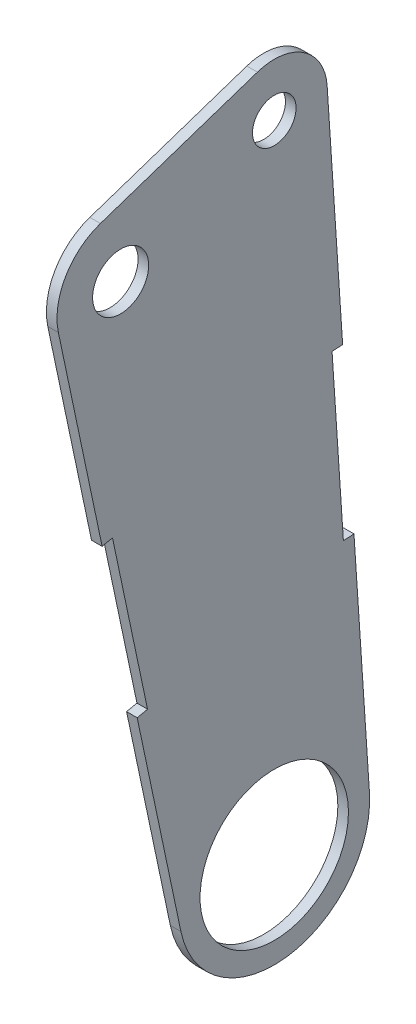
ISO-10303-21;
HEADER;
FILE_DESCRIPTION(('STEP AP214'),'2;1');
FILE_NAME('part.step','',(''),(''),'','','');
FILE_SCHEMA(('AUTOMOTIVE_DESIGN { 1 0 10303 214 1 1 1 1 }'));
ENDSEC;
DATA;
#1=APPLICATION_CONTEXT('core data for automotive mechanical design processes');
#2=APPLICATION_PROTOCOL_DEFINITION('international standard','automotive_design',2000,#1);
#3=PRODUCT_CONTEXT('',#1,'mechanical');
#4=PRODUCT('Part','Part','',(#3));
#5=PRODUCT_RELATED_PRODUCT_CATEGORY('part','',(#4));
#6=PRODUCT_DEFINITION_FORMATION('','',#4);
#7=PRODUCT_DEFINITION_CONTEXT('part definition',#1,'design');
#8=PRODUCT_DEFINITION('design','',#6,#7);
#9=PRODUCT_DEFINITION_SHAPE('','',#8);
#10=(LENGTH_UNIT() NAMED_UNIT(*) SI_UNIT(.MILLI.,.METRE.));
#11=(NAMED_UNIT(*) PLANE_ANGLE_UNIT() SI_UNIT($,.RADIAN.));
#12=(NAMED_UNIT(*) SI_UNIT($,.STERADIAN.) SOLID_ANGLE_UNIT());
#13=UNCERTAINTY_MEASURE_WITH_UNIT(LENGTH_MEASURE(1.E-05),#10,'distance_accuracy_value','');
#14=(GEOMETRIC_REPRESENTATION_CONTEXT(3) GLOBAL_UNCERTAINTY_ASSIGNED_CONTEXT((#13)) GLOBAL_UNIT_ASSIGNED_CONTEXT((#10,
#11,#12)) REPRESENTATION_CONTEXT('',''));
#15=CARTESIAN_POINT('',(0.,0.,0.));
#16=DIRECTION('',(0.,0.,1.));
#17=DIRECTION('',(1.,0.,0.));
#18=AXIS2_PLACEMENT_3D('',#15,#16,#17);
#19=CARTESIAN_POINT('',(1.5875,95.25,0.));
#20=DIRECTION('',(-1.,0.,0.));
#21=DIRECTION('',(0.,0.,1.));
#22=AXIS2_PLACEMENT_3D('',#19,#20,#21);
#23=CYLINDRICAL_SURFACE('',#22,7.93749999999998);
#24=CARTESIAN_POINT('',(0.,95.25,0.));
#25=DIRECTION('',(1.,0.,0.));
#26=DIRECTION('',(0.,0.,-1.));
#27=AXIS2_PLACEMENT_3D('',#24,#25,#26);
#28=CIRCLE('',#27,7.93749999999998);
#29=CARTESIAN_POINT('',(0.,102.776694664712,2.52047092310002));
#30=VERTEX_POINT('',#29);
#31=CARTESIAN_POINT('',(0.,95.7791666666667,-7.91984146867151));
#32=VERTEX_POINT('',#31);
#33=EDGE_CURVE('E210',#30,#32,#28,.F.);
#34=ORIENTED_EDGE('',*,*,#33,.F.);
#35=DIRECTION('',(-1.,0.,0.));
#36=VECTOR('',#35,1.);
#37=CARTESIAN_POINT('',(1.5875,102.776694664712,2.52047092310002));
#38=LINE('',#37,#36);
#39=CARTESIAN_POINT('',(1.5875,102.776694664712,2.52047092310002));
#40=VERTEX_POINT('',#39);
#41=EDGE_CURVE('E11',#40,#30,#38,.T.);
#42=ORIENTED_EDGE('',*,*,#41,.F.);
#43=CARTESIAN_POINT('',(1.5875,95.25,0.));
#44=DIRECTION('',(1.,0.,0.));
#45=DIRECTION('',(0.,0.,-1.));
#46=AXIS2_PLACEMENT_3D('',#43,#44,#45);
#47=CIRCLE('',#46,7.93749999999998);
#48=CARTESIAN_POINT('',(1.5875,95.7791666666667,-7.91984146867151));
#49=VERTEX_POINT('',#48);
#50=EDGE_CURVE('E274',#40,#49,#47,.F.);
#51=ORIENTED_EDGE('',*,*,#50,.T.);
#52=DIRECTION('',(-1.,0.,0.));
#53=VECTOR('',#52,1.);
#54=CARTESIAN_POINT('',(1.5875,95.7791666666667,-7.91984146867151));
#55=LINE('',#54,#53);
#56=EDGE_CURVE('E56',#49,#32,#55,.T.);
#57=ORIENTED_EDGE('',*,*,#56,.T.);
#58=EDGE_LOOP('',(#34,#42,#51,#57));
#59=FACE_BOUND('',#58,.T.);
#60=ADVANCED_FACE('F39',(#59),#23,.T.);
#61=CARTESIAN_POINT('',(1.5875,93.1725013934917,31.2007582419675));
#62=DIRECTION('',(0.,0.948244997129098,0.317539643855121));
#63=DIRECTION('',(0.,-0.317539643855121,0.948244997129098));
#64=AXIS2_PLACEMENT_3D('',#61,#62,#63);
#65=PLANE('',#64);
#66=DIRECTION('',(0.,0.317539643855121,-0.948244997129098));
#67=VECTOR('',#66,1.);
#68=CARTESIAN_POINT('',(0.,93.1725013934917,31.2007582419675));
#69=LINE('',#68,#67);
#70=CARTESIAN_POINT('',(0.,94.9028395547528,26.0335782173342));
#71=VERTEX_POINT('',#70);
#72=EDGE_CURVE('E207',#71,#30,#69,.T.);
#73=ORIENTED_EDGE('',*,*,#72,.F.);
#74=DIRECTION('',(-1.,0.,0.));
#75=VECTOR('',#74,1.);
#76=CARTESIAN_POINT('',(1.5875,94.9028395547528,26.0335782173342));
#77=LINE('',#76,#75);
#78=CARTESIAN_POINT('',(1.5875,94.9028395547528,26.0335782173342));
#79=VERTEX_POINT('',#78);
#80=EDGE_CURVE('E48',#79,#71,#77,.T.);
#81=ORIENTED_EDGE('',*,*,#80,.F.);
#82=DIRECTION('',(0.,0.317539643855121,-0.948244997129098));
#83=VECTOR('',#82,1.);
#84=CARTESIAN_POINT('',(1.5875,93.1725013934917,31.2007582419675));
#85=LINE('',#84,#83);
#86=EDGE_CURVE('E272',#79,#40,#85,.T.);
#87=ORIENTED_EDGE('',*,*,#86,.T.);
#88=ORIENTED_EDGE('',*,*,#41,.T.);
#89=EDGE_LOOP('',(#73,#81,#87,#88));
#90=FACE_BOUND('',#89,.T.);
#91=ADVANCED_FACE('F208',(#90),#65,.T.);
#92=CARTESIAN_POINT('',(1.5875,85.8708059570982,23.0090131096142));
#93=DIRECTION('',(-1.,0.,0.));
#94=DIRECTION('',(0.,0.,1.));
#95=AXIS2_PLACEMENT_3D('',#92,#93,#94);
#96=CYLINDRICAL_SURFACE('',#95,9.52499999999999);
#97=CARTESIAN_POINT('',(0.,85.8708059570982,23.0090131096142));
#98=DIRECTION('',(1.,0.,0.));
#99=DIRECTION('',(0.,0.,-1.));
#100=AXIS2_PLACEMENT_3D('',#97,#98,#99);
#101=CIRCLE('',#100,9.52499999999999);
#102=CARTESIAN_POINT('',(0.,83.9019755057453,32.3283119917096));
#103=VERTEX_POINT('',#102);
#104=EDGE_CURVE('E202',#103,#71,#101,.F.);
#105=ORIENTED_EDGE('',*,*,#104,.F.);
#106=DIRECTION('',(-1.,0.,0.));
#107=VECTOR('',#106,1.);
#108=CARTESIAN_POINT('',(1.5875,83.9019755057453,32.3283119917096));
#109=LINE('',#108,#107);
#110=CARTESIAN_POINT('',(1.5875,83.9019755057453,32.3283119917096));
#111=VERTEX_POINT('',#110);
#112=EDGE_CURVE('E194',#111,#103,#109,.T.);
#113=ORIENTED_EDGE('',*,*,#112,.F.);
#114=CARTESIAN_POINT('',(1.5875,85.8708059570982,23.0090131096142));
#115=DIRECTION('',(1.,0.,0.));
#116=DIRECTION('',(0.,0.,-1.));
#117=AXIS2_PLACEMENT_3D('',#114,#115,#116);
#118=CIRCLE('',#117,9.52499999999999);
#119=EDGE_CURVE('E204',#111,#79,#118,.F.);
#120=ORIENTED_EDGE('',*,*,#119,.T.);
#121=ORIENTED_EDGE('',*,*,#80,.T.);
#122=EDGE_LOOP('',(#105,#113,#120,#121));
#123=FACE_BOUND('',#122,.T.);
#124=ADVANCED_FACE('F200',(#123),#96,.T.);
#125=CARTESIAN_POINT('',(1.5875,-2.95324567702929,13.9789483231432));
#126=DIRECTION('',(0.,0.206701359722085,-0.97840408210976));
#127=DIRECTION('',(0.,0.97840408210976,0.206701359722085));
#128=AXIS2_PLACEMENT_3D('',#125,#126,#127);
#129=PLANE('',#128);
#130=DIRECTION('',(0.,-0.97840408210976,-0.206701359722085));
#131=VECTOR('',#130,1.);
#132=CARTESIAN_POINT('',(0.,-2.95324567702929,13.9789483231432));
#133=LINE('',#132,#131);
#134=CARTESIAN_POINT('',(0.,52.9000967571519,25.7787374258969));
#135=VERTEX_POINT('',#134);
#136=EDGE_CURVE('E216',#103,#135,#133,.T.);
#137=ORIENTED_EDGE('',*,*,#136,.T.);
#138=DIRECTION('',(-1.,0.,0.));
#139=VECTOR('',#138,1.);
#140=CARTESIAN_POINT('',(1.5875,52.9000967571519,25.7787374258969));
#141=LINE('',#140,#139);
#142=CARTESIAN_POINT('',(1.5875,52.9000967571519,25.7787374258969));
#143=VERTEX_POINT('',#142);
#144=EDGE_CURVE('E191',#143,#135,#141,.T.);
#145=ORIENTED_EDGE('',*,*,#144,.F.);
#146=DIRECTION('',(0.,-0.97840408210976,-0.206701359722085));
#147=VECTOR('',#146,1.);
#148=CARTESIAN_POINT('',(1.5875,-2.95324567702929,13.9789483231432));
#149=LINE('',#148,#147);
#150=EDGE_CURVE('E261',#111,#143,#149,.T.);
#151=ORIENTED_EDGE('',*,*,#150,.F.);
#152=ORIENTED_EDGE('',*,*,#112,.T.);
#153=EDGE_LOOP('',(#137,#145,#151,#152));
#154=FACE_BOUND('',#153,.T.);
#155=ADVANCED_FACE('F329',(#154),#129,.F.);
#156=CARTESIAN_POINT('',(1.5875,55.8533424341812,11.7997891027538));
#157=DIRECTION('',(0.,0.978404082109759,0.206701359722087));
#158=DIRECTION('',(0.,-0.206701359722087,0.978404082109759));
#159=AXIS2_PLACEMENT_3D('',#156,#157,#158);
#160=PLANE('',#159);
#161=DIRECTION('',(0.,0.206701359722087,-0.978404082109759));
#162=VECTOR('',#161,1.);
#163=CARTESIAN_POINT('',(0.,55.8533424341812,11.7997891027538));
#164=LINE('',#163,#162);
#165=CARTESIAN_POINT('',(0.,53.2282351657108,24.2255209455476));
#166=VERTEX_POINT('',#165);
#167=EDGE_CURVE('E218',#135,#166,#164,.T.);
#168=ORIENTED_EDGE('',*,*,#167,.T.);
#169=DIRECTION('',(-1.,0.,0.));
#170=VECTOR('',#169,1.);
#171=CARTESIAN_POINT('',(1.5875,53.2282351657108,24.2255209455476));
#172=LINE('',#171,#170);
#173=CARTESIAN_POINT('',(1.5875,53.2282351657108,24.2255209455476));
#174=VERTEX_POINT('',#173);
#175=EDGE_CURVE('E189',#174,#166,#172,.T.);
#176=ORIENTED_EDGE('',*,*,#175,.F.);
#177=DIRECTION('',(0.,0.206701359722087,-0.978404082109759));
#178=VECTOR('',#177,1.);
#179=CARTESIAN_POINT('',(1.5875,55.8533424341812,11.7997891027538));
#180=LINE('',#179,#178);
#181=EDGE_CURVE('E268',#143,#174,#180,.T.);
#182=ORIENTED_EDGE('',*,*,#181,.F.);
#183=ORIENTED_EDGE('',*,*,#144,.T.);
#184=EDGE_LOOP('',(#168,#176,#182,#183));
#185=FACE_BOUND('',#184,.T.);
#186=ADVANCED_FACE('F330',(#185),#160,.F.);
#187=CARTESIAN_POINT('',(1.5875,-2.62510726847048,12.4257318427939));
#188=DIRECTION('',(0.,-0.206701359722086,0.978404082109759));
#189=DIRECTION('',(0.,-0.97840408210976,-0.206701359722086));
#190=AXIS2_PLACEMENT_3D('',#187,#188,#189);
#191=PLANE('',#190);
#192=DIRECTION('',(0.,0.97840408210976,0.206701359722086));
#193=VECTOR('',#192,1.);
#194=CARTESIAN_POINT('',(0.,-2.62510726847048,12.4257318427939));
#195=LINE('',#194,#193);
#196=CARTESIAN_POINT('',(0.,28.3767714801229,18.9753064086067));
#197=VERTEX_POINT('',#196);
#198=EDGE_CURVE('E225',#197,#166,#195,.T.);
#199=ORIENTED_EDGE('',*,*,#198,.F.);
#200=DIRECTION('',(-1.,0.,0.));
#201=VECTOR('',#200,1.);
#202=CARTESIAN_POINT('',(1.5875,28.3767714801229,18.9753064086067));
#203=LINE('',#202,#201);
#204=CARTESIAN_POINT('',(1.5875,28.3767714801229,18.9753064086067));
#205=VERTEX_POINT('',#204);
#206=EDGE_CURVE('E187',#205,#197,#203,.T.);
#207=ORIENTED_EDGE('',*,*,#206,.F.);
#208=DIRECTION('',(0.,0.97840408210976,0.206701359722086));
#209=VECTOR('',#208,1.);
#210=CARTESIAN_POINT('',(1.5875,-2.62510726847048,12.4257318427939));
#211=LINE('',#210,#209);
#212=EDGE_CURVE('E265',#205,#174,#211,.T.);
#213=ORIENTED_EDGE('',*,*,#212,.T.);
#214=ORIENTED_EDGE('',*,*,#175,.T.);
#215=EDGE_LOOP('',(#199,#207,#213,#214));
#216=FACE_BOUND('',#215,.T.);
#217=ADVANCED_FACE('F333',(#216),#191,.T.);
#218=CARTESIAN_POINT('',(1.5875,31.0018787485933,6.54957456581277));
#219=DIRECTION('',(0.,0.978404082109759,0.206701359722085));
#220=DIRECTION('',(0.,-0.206701359722085,0.97840408210976));
#221=AXIS2_PLACEMENT_3D('',#218,#219,#220);
#222=PLANE('',#221);
#223=DIRECTION('',(0.,0.206701359722085,-0.97840408210976));
#224=VECTOR('',#223,1.);
#225=CARTESIAN_POINT('',(0.,31.0018787485933,6.54957456581277));
#226=LINE('',#225,#224);
#227=CARTESIAN_POINT('',(0.,28.0486330715641,20.5285228889559));
#228=VERTEX_POINT('',#227);
#229=EDGE_CURVE('E228',#228,#197,#226,.T.);
#230=ORIENTED_EDGE('',*,*,#229,.F.);
#231=DIRECTION('',(-1.,0.,0.));
#232=VECTOR('',#231,1.);
#233=CARTESIAN_POINT('',(1.5875,28.0486330715641,20.5285228889559));
#234=LINE('',#233,#232);
#235=CARTESIAN_POINT('',(1.5875,28.0486330715641,20.5285228889559));
#236=VERTEX_POINT('',#235);
#237=EDGE_CURVE('E185',#236,#228,#234,.T.);
#238=ORIENTED_EDGE('',*,*,#237,.F.);
#239=DIRECTION('',(0.,0.206701359722085,-0.97840408210976));
#240=VECTOR('',#239,1.);
#241=CARTESIAN_POINT('',(1.5875,31.0018787485933,6.54957456581277));
#242=LINE('',#241,#240);
#243=EDGE_CURVE('E259',#236,#205,#242,.T.);
#244=ORIENTED_EDGE('',*,*,#243,.T.);
#245=ORIENTED_EDGE('',*,*,#206,.T.);
#246=EDGE_LOOP('',(#230,#238,#244,#245));
#247=FACE_BOUND('',#246,.T.);
#248=ADVANCED_FACE('F337',(#247),#222,.T.);
#249=CARTESIAN_POINT('',(0.,-2.95324567702929,13.9789483231432));
#250=VERTEX_POINT('',#249);
#251=EDGE_CURVE('E220',#228,#250,#133,.T.);
#252=ORIENTED_EDGE('',*,*,#251,.T.);
#253=DIRECTION('',(-1.,0.,0.));
#254=VECTOR('',#253,1.);
#255=CARTESIAN_POINT('',(1.5875,-2.95324567702929,13.9789483231432));
#256=LINE('',#255,#254);
#257=CARTESIAN_POINT('',(1.5875,-2.95324567702929,13.9789483231432));
#258=VERTEX_POINT('',#257);
#259=EDGE_CURVE('E181',#258,#250,#256,.T.);
#260=ORIENTED_EDGE('',*,*,#259,.F.);
#261=EDGE_CURVE('E255',#236,#258,#149,.T.);
#262=ORIENTED_EDGE('',*,*,#261,.F.);
#263=ORIENTED_EDGE('',*,*,#237,.T.);
#264=EDGE_LOOP('',(#252,#260,#262,#263));
#265=FACE_BOUND('',#264,.T.);
#266=ADVANCED_FACE('F341',(#265),#129,.F.);
#267=CARTESIAN_POINT('',(1.5875,0.,0.));
#268=DIRECTION('',(-1.,0.,0.));
#269=DIRECTION('',(0.,0.,1.));
#270=AXIS2_PLACEMENT_3D('',#267,#268,#269);
#271=CYLINDRICAL_SURFACE('',#270,14.2875);
#272=CARTESIAN_POINT('',(0.,0.,0.));
#273=DIRECTION('',(1.,0.,0.));
#274=DIRECTION('',(0.,0.,-1.));
#275=AXIS2_PLACEMENT_3D('',#272,#273,#274);
#276=CIRCLE('',#275,14.2875);
#277=CARTESIAN_POINT('',(0.,0.952500000000003,-14.2557146436087));
#278=VERTEX_POINT('',#277);
#279=EDGE_CURVE('E231',#250,#278,#276,.T.);
#280=ORIENTED_EDGE('',*,*,#279,.T.);
#281=DIRECTION('',(-1.,0.,0.));
#282=VECTOR('',#281,1.);
#283=CARTESIAN_POINT('',(1.5875,0.952500000000003,-14.2557146436087));
#284=LINE('',#283,#282);
#285=CARTESIAN_POINT('',(1.5875,0.952500000000003,-14.2557146436087));
#286=VERTEX_POINT('',#285);
#287=EDGE_CURVE('E178',#286,#278,#284,.T.);
#288=ORIENTED_EDGE('',*,*,#287,.F.);
#289=CARTESIAN_POINT('',(1.5875,0.,0.));
#290=DIRECTION('',(1.,0.,0.));
#291=DIRECTION('',(0.,0.,-1.));
#292=AXIS2_PLACEMENT_3D('',#289,#290,#291);
#293=CIRCLE('',#292,14.2875);
#294=EDGE_CURVE('E251',#258,#286,#293,.T.);
#295=ORIENTED_EDGE('',*,*,#294,.F.);
#296=ORIENTED_EDGE('',*,*,#259,.T.);
#297=EDGE_LOOP('',(#280,#288,#295,#296));
#298=FACE_BOUND('',#297,.T.);
#299=ADVANCED_FACE('F320',(#298),#271,.T.);
#300=CARTESIAN_POINT('',(1.5875,0.952500000000003,-14.2557146436087));
#301=DIRECTION('',(0.,0.0666666666666668,-0.997775303139718));
#302=DIRECTION('',(0.,0.997775303139718,0.0666666666666668));
#303=AXIS2_PLACEMENT_3D('',#300,#301,#302);
#304=PLANE('',#303);
#305=DIRECTION('',(0.,-0.997775303139718,-0.0666666666666668));
#306=VECTOR('',#305,1.);
#307=CARTESIAN_POINT('',(0.,0.952500000000003,-14.2557146436087));
#308=LINE('',#307,#306);
#309=CARTESIAN_POINT('',(0.,35.6658333333333,-11.9363324992121));
#310=VERTEX_POINT('',#309);
#311=EDGE_CURVE('E235',#310,#278,#308,.T.);
#312=ORIENTED_EDGE('',*,*,#311,.F.);
#313=DIRECTION('',(-1.,0.,0.));
#314=VECTOR('',#313,1.);
#315=CARTESIAN_POINT('',(1.5875,35.6658333333333,-11.9363324992121));
#316=LINE('',#315,#314);
#317=CARTESIAN_POINT('',(1.5875,35.6658333333333,-11.9363324992121));
#318=VERTEX_POINT('',#317);
#319=EDGE_CURVE('E172',#318,#310,#316,.T.);
#320=ORIENTED_EDGE('',*,*,#319,.F.);
#321=DIRECTION('',(0.,-0.997775303139718,-0.0666666666666668));
#322=VECTOR('',#321,1.);
#323=CARTESIAN_POINT('',(1.5875,0.952500000000003,-14.2557146436087));
#324=LINE('',#323,#322);
#325=EDGE_CURVE('E246',#318,#286,#324,.T.);
#326=ORIENTED_EDGE('',*,*,#325,.T.);
#327=ORIENTED_EDGE('',*,*,#287,.T.);
#328=EDGE_LOOP('',(#312,#320,#326,#327));
#329=FACE_BOUND('',#328,.T.);
#330=ADVANCED_FACE('F313',(#329),#304,.T.);
#331=CARTESIAN_POINT('',(1.5875,34.7133333333337,2.31938214439591));
#332=DIRECTION('',(0.,0.997775303139719,0.0666666666666447));
#333=DIRECTION('',(0.,-0.0666666666666447,0.997775303139719));
#334=AXIS2_PLACEMENT_3D('',#331,#332,#333);
#335=PLANE('',#334);
#336=DIRECTION('',(0.,0.0666666666666447,-0.997775303139719));
#337=VECTOR('',#336,1.);
#338=CARTESIAN_POINT('',(0.,34.7133333333337,2.31938214439591));
#339=LINE('',#338,#337);
#340=CARTESIAN_POINT('',(0.,35.56,-10.3523642054778));
#341=VERTEX_POINT('',#340);
#342=EDGE_CURVE('E239',#341,#310,#339,.T.);
#343=ORIENTED_EDGE('',*,*,#342,.F.);
#344=DIRECTION('',(-1.,0.,0.));
#345=VECTOR('',#344,1.);
#346=CARTESIAN_POINT('',(1.5875,35.56,-10.3523642054778));
#347=LINE('',#346,#345);
#348=CARTESIAN_POINT('',(1.5875,35.56,-10.3523642054778));
#349=VERTEX_POINT('',#348);
#350=EDGE_CURVE('E170',#349,#341,#347,.T.);
#351=ORIENTED_EDGE('',*,*,#350,.F.);
#352=DIRECTION('',(0.,0.0666666666666447,-0.997775303139719));
#353=VECTOR('',#352,1.);
#354=CARTESIAN_POINT('',(1.5875,34.7133333333337,2.31938214439591));
#355=LINE('',#354,#353);
#356=EDGE_CURVE('E164',#349,#318,#355,.T.);
#357=ORIENTED_EDGE('',*,*,#356,.T.);
#358=ORIENTED_EDGE('',*,*,#319,.T.);
#359=EDGE_LOOP('',(#343,#351,#357,#358));
#360=FACE_BOUND('',#359,.T.);
#361=ADVANCED_FACE('F319',(#360),#335,.T.);
#362=CARTESIAN_POINT('',(1.5875,0.846666666666668,-12.6717463498744));
#363=DIRECTION('',(0.,-0.0666666666666667,0.997775303139718));
#364=DIRECTION('',(0.,-0.997775303139718,-0.0666666666666667));
#365=AXIS2_PLACEMENT_3D('',#362,#363,#364);
#366=PLANE('',#365);
#367=DIRECTION('',(0.,0.997775303139718,0.0666666666666668));
#368=VECTOR('',#367,1.);
#369=CARTESIAN_POINT('',(0.,0.846666666666668,-12.6717463498744));
#370=LINE('',#369,#368);
#371=CARTESIAN_POINT('',(0.,60.96,-8.65525531933386));
#372=VERTEX_POINT('',#371);
#373=EDGE_CURVE('E169',#341,#372,#370,.T.);
#374=ORIENTED_EDGE('',*,*,#373,.T.);
#375=DIRECTION('',(-1.,0.,0.));
#376=VECTOR('',#375,1.);
#377=CARTESIAN_POINT('',(1.5875,60.96,-8.65525531933386));
#378=LINE('',#377,#376);
#379=CARTESIAN_POINT('',(1.5875,60.96,-8.65525531933386));
#380=VERTEX_POINT('',#379);
#381=EDGE_CURVE('E151',#380,#372,#378,.T.);
#382=ORIENTED_EDGE('',*,*,#381,.F.);
#383=DIRECTION('',(0.,0.997775303139718,0.0666666666666668));
#384=VECTOR('',#383,1.);
#385=CARTESIAN_POINT('',(1.5875,0.846666666666668,-12.6717463498744));
#386=LINE('',#385,#384);
#387=EDGE_CURVE('E156',#349,#380,#386,.T.);
#388=ORIENTED_EDGE('',*,*,#387,.F.);
#389=ORIENTED_EDGE('',*,*,#350,.T.);
#390=EDGE_LOOP('',(#374,#382,#388,#389));
#391=FACE_BOUND('',#390,.T.);
#392=ADVANCED_FACE('F167',(#391),#366,.F.);
#393=CARTESIAN_POINT('',(1.5875,60.1133333333332,4.01649103054106));
#394=DIRECTION('',(0.,0.997775303139717,0.0666666666666752));
#395=DIRECTION('',(0.,-0.0666666666666752,0.997775303139717));
#396=AXIS2_PLACEMENT_3D('',#393,#394,#395);
#397=PLANE('',#396);
#398=DIRECTION('',(0.,0.0666666666666752,-0.997775303139717));
#399=VECTOR('',#398,1.);
#400=CARTESIAN_POINT('',(0.,60.1133333333332,4.01649103054106));
#401=LINE('',#400,#399);
#402=CARTESIAN_POINT('',(0.,61.0658333333334,-10.2392236130682));
#403=VERTEX_POINT('',#402);
#404=EDGE_CURVE('E244',#372,#403,#401,.T.);
#405=ORIENTED_EDGE('',*,*,#404,.T.);
#406=DIRECTION('',(-1.,0.,0.));
#407=VECTOR('',#406,1.);
#408=CARTESIAN_POINT('',(1.5875,61.0658333333334,-10.2392236130682));
#409=LINE('',#408,#407);
#410=CARTESIAN_POINT('',(1.5875,61.0658333333334,-10.2392236130682));
#411=VERTEX_POINT('',#410);
#412=EDGE_CURVE('E103',#411,#403,#409,.T.);
#413=ORIENTED_EDGE('',*,*,#412,.F.);
#414=DIRECTION('',(0.,0.0666666666666752,-0.997775303139717));
#415=VECTOR('',#414,1.);
#416=CARTESIAN_POINT('',(1.5875,60.1133333333332,4.01649103054106));
#417=LINE('',#416,#415);
#418=EDGE_CURVE('E147',#380,#411,#417,.T.);
#419=ORIENTED_EDGE('',*,*,#418,.F.);
#420=ORIENTED_EDGE('',*,*,#381,.T.);
#421=EDGE_LOOP('',(#405,#413,#419,#420));
#422=FACE_BOUND('',#421,.T.);
#423=ADVANCED_FACE('F149',(#422),#397,.F.);
#424=CARTESIAN_POINT('',(1.5875,0.,0.));
#425=DIRECTION('',(-1.,0.,0.));
#426=DIRECTION('',(0.,0.,1.));
#427=AXIS2_PLACEMENT_3D('',#424,#425,#426);
#428=CYLINDRICAL_SURFACE('',#427,11.1125);
#429=CARTESIAN_POINT('',(1.5875,0.,0.));
#430=DIRECTION('',(1.,0.,0.));
#431=DIRECTION('',(0.,0.,-1.));
#432=AXIS2_PLACEMENT_3D('',#429,#430,#431);
#433=CIRCLE('',#432,11.1125);
#434=CARTESIAN_POINT('',(1.5875,0.,-11.1125));
#435=VERTEX_POINT('',#434);
#436=EDGE_CURVE('E276',#435,#435,#433,.T.);
#437=ORIENTED_EDGE('',*,*,#436,.T.);
#438=EDGE_LOOP('',(#437));
#439=FACE_BOUND('',#438,.T.);
#440=CARTESIAN_POINT('',(0.,0.,0.));
#441=DIRECTION('',(1.,0.,0.));
#442=DIRECTION('',(0.,0.,-1.));
#443=AXIS2_PLACEMENT_3D('',#440,#441,#442);
#444=CIRCLE('',#443,11.1125);
#445=CARTESIAN_POINT('',(0.,0.,-11.1125));
#446=VERTEX_POINT('',#445);
#447=EDGE_CURVE('E283',#446,#446,#444,.T.);
#448=ORIENTED_EDGE('',*,*,#447,.F.);
#449=EDGE_LOOP('',(#448));
#450=FACE_BOUND('',#449,.T.);
#451=ADVANCED_FACE('F41',(#439,#450),#428,.F.);
#452=EDGE_CURVE('E240',#32,#403,#308,.T.);
#453=ORIENTED_EDGE('',*,*,#452,.F.);
#454=ORIENTED_EDGE('',*,*,#56,.F.);
#455=EDGE_CURVE('E155',#49,#411,#324,.T.);
#456=ORIENTED_EDGE('',*,*,#455,.T.);
#457=ORIENTED_EDGE('',*,*,#412,.T.);
#458=EDGE_LOOP('',(#453,#454,#456,#457));
#459=FACE_BOUND('',#458,.T.);
#460=ADVANCED_FACE('F297',(#459),#304,.T.);
#461=CARTESIAN_POINT('',(1.5875,0.,0.));
#462=DIRECTION('',(1.,0.,0.));
#463=DIRECTION('',(0.,0.,-1.));
#464=AXIS2_PLACEMENT_3D('',#461,#462,#463);
#465=PLANE('',#464);
#466=ORIENTED_EDGE('',*,*,#86,.F.);
#467=ORIENTED_EDGE('',*,*,#119,.F.);
#468=ORIENTED_EDGE('',*,*,#150,.T.);
#469=ORIENTED_EDGE('',*,*,#181,.T.);
#470=ORIENTED_EDGE('',*,*,#212,.F.);
#471=ORIENTED_EDGE('',*,*,#243,.F.);
#472=ORIENTED_EDGE('',*,*,#261,.T.);
#473=ORIENTED_EDGE('',*,*,#294,.T.);
#474=ORIENTED_EDGE('',*,*,#325,.F.);
#475=ORIENTED_EDGE('',*,*,#356,.F.);
#476=ORIENTED_EDGE('',*,*,#387,.T.);
#477=ORIENTED_EDGE('',*,*,#418,.T.);
#478=ORIENTED_EDGE('',*,*,#455,.F.);
#479=ORIENTED_EDGE('',*,*,#50,.F.);
#480=EDGE_LOOP('',(#466,#467,#468,#469,#470,#471,#472,#473,#474,#475,#476,#477,#478,#479));
#481=FACE_BOUND('',#480,.T.);
#482=CARTESIAN_POINT('',(1.5875,85.8708059570982,23.0090131096142));
#483=DIRECTION('',(1.,0.,0.));
#484=DIRECTION('',(0.,0.,-1.));
#485=AXIS2_PLACEMENT_3D('',#482,#483,#484);
#486=CIRCLE('',#485,4.2);
#487=CARTESIAN_POINT('',(1.5875,85.8708059570982,18.8090131096142));
#488=VERTEX_POINT('',#487);
#489=EDGE_CURVE('E290',#488,#488,#486,.T.);
#490=ORIENTED_EDGE('',*,*,#489,.F.);
#491=EDGE_LOOP('',(#490));
#492=FACE_BOUND('',#491,.T.);
#493=CARTESIAN_POINT('',(1.5875,95.25,0.));
#494=DIRECTION('',(1.,0.,0.));
#495=DIRECTION('',(0.,0.,-1.));
#496=AXIS2_PLACEMENT_3D('',#493,#494,#495);
#497=CIRCLE('',#496,3.26389999999999);
#498=CARTESIAN_POINT('',(1.5875,95.25,-3.26389999999999));
#499=VERTEX_POINT('',#498);
#500=EDGE_CURVE('E284',#499,#499,#497,.T.);
#501=ORIENTED_EDGE('',*,*,#500,.F.);
#502=EDGE_LOOP('',(#501));
#503=FACE_BOUND('',#502,.T.);
#504=ORIENTED_EDGE('',*,*,#436,.F.);
#505=EDGE_LOOP('',(#504));
#506=FACE_BOUND('',#505,.T.);
#507=ADVANCED_FACE('F160',(#481,#492,#503,#506),#465,.T.);
#508=CARTESIAN_POINT('',(0.,0.,0.));
#509=DIRECTION('',(1.,0.,0.));
#510=DIRECTION('',(0.,0.,-1.));
#511=AXIS2_PLACEMENT_3D('',#508,#509,#510);
#512=PLANE('',#511);
#513=ORIENTED_EDGE('',*,*,#72,.T.);
#514=ORIENTED_EDGE('',*,*,#33,.T.);
#515=ORIENTED_EDGE('',*,*,#452,.T.);
#516=ORIENTED_EDGE('',*,*,#404,.F.);
#517=ORIENTED_EDGE('',*,*,#373,.F.);
#518=ORIENTED_EDGE('',*,*,#342,.T.);
#519=ORIENTED_EDGE('',*,*,#311,.T.);
#520=ORIENTED_EDGE('',*,*,#279,.F.);
#521=ORIENTED_EDGE('',*,*,#251,.F.);
#522=ORIENTED_EDGE('',*,*,#229,.T.);
#523=ORIENTED_EDGE('',*,*,#198,.T.);
#524=ORIENTED_EDGE('',*,*,#167,.F.);
#525=ORIENTED_EDGE('',*,*,#136,.F.);
#526=ORIENTED_EDGE('',*,*,#104,.T.);
#527=EDGE_LOOP('',(#513,#514,#515,#516,#517,#518,#519,#520,#521,#522,#523,#524,#525,#526));
#528=FACE_BOUND('',#527,.T.);
#529=CARTESIAN_POINT('',(0.,85.8708059570982,23.0090131096142));
#530=DIRECTION('',(1.,0.,0.));
#531=DIRECTION('',(0.,0.,-1.));
#532=AXIS2_PLACEMENT_3D('',#529,#530,#531);
#533=CIRCLE('',#532,4.2);
#534=CARTESIAN_POINT('',(0.,85.8708059570982,18.8090131096142));
#535=VERTEX_POINT('',#534);
#536=EDGE_CURVE('E287',#535,#535,#533,.T.);
#537=ORIENTED_EDGE('',*,*,#536,.T.);
#538=EDGE_LOOP('',(#537));
#539=FACE_BOUND('',#538,.T.);
#540=CARTESIAN_POINT('',(0.,95.25,0.));
#541=DIRECTION('',(1.,0.,0.));
#542=DIRECTION('',(0.,0.,-1.));
#543=AXIS2_PLACEMENT_3D('',#540,#541,#542);
#544=CIRCLE('',#543,3.2639);
#545=CARTESIAN_POINT('',(0.,95.25,-3.2639));
#546=VERTEX_POINT('',#545);
#547=EDGE_CURVE('E280',#546,#546,#544,.T.);
#548=ORIENTED_EDGE('',*,*,#547,.T.);
#549=EDGE_LOOP('',(#548));
#550=FACE_BOUND('',#549,.T.);
#551=ORIENTED_EDGE('',*,*,#447,.T.);
#552=EDGE_LOOP('',(#551));
#553=FACE_BOUND('',#552,.T.);
#554=ADVANCED_FACE('F213',(#528,#539,#550,#553),#512,.F.);
#555=CARTESIAN_POINT('',(1.5875,95.25,0.));
#556=DIRECTION('',(1.,0.,0.));
#557=DIRECTION('',(0.,0.,-1.));
#558=AXIS2_PLACEMENT_3D('',#555,#556,#557);
#559=CYLINDRICAL_SURFACE('',#558,3.26389999999999);
#560=ORIENTED_EDGE('',*,*,#547,.F.);
#561=EDGE_LOOP('',(#560));
#562=FACE_BOUND('',#561,.T.);
#563=ORIENTED_EDGE('',*,*,#500,.T.);
#564=EDGE_LOOP('',(#563));
#565=FACE_BOUND('',#564,.T.);
#566=ADVANCED_FACE('F372',(#562,#565),#559,.F.);
#567=CARTESIAN_POINT('',(1.5875,85.8708059570982,23.0090131096142));
#568=DIRECTION('',(1.,0.,0.));
#569=DIRECTION('',(0.,0.,-1.));
#570=AXIS2_PLACEMENT_3D('',#567,#568,#569);
#571=CYLINDRICAL_SURFACE('',#570,4.2);
#572=ORIENTED_EDGE('',*,*,#536,.F.);
#573=EDGE_LOOP('',(#572));
#574=FACE_BOUND('',#573,.T.);
#575=ORIENTED_EDGE('',*,*,#489,.T.);
#576=EDGE_LOOP('',(#575));
#577=FACE_BOUND('',#576,.T.);
#578=ADVANCED_FACE('F294',(#574,#577),#571,.F.);
#579=CLOSED_SHELL('',(#60,#91,#124,#155,#186,#217,#248,#266,#299,#330,#361,#392,#423,#451,#460,
#507,#554,#566,#578));
#580=MANIFOLD_SOLID_BREP('B2',#579);
#581=ADVANCED_BREP_SHAPE_REPRESENTATION('',(#18,#580),#14);
#582=SHAPE_DEFINITION_REPRESENTATION(#9,#581);
ENDSEC;
END-ISO-10303-21;
